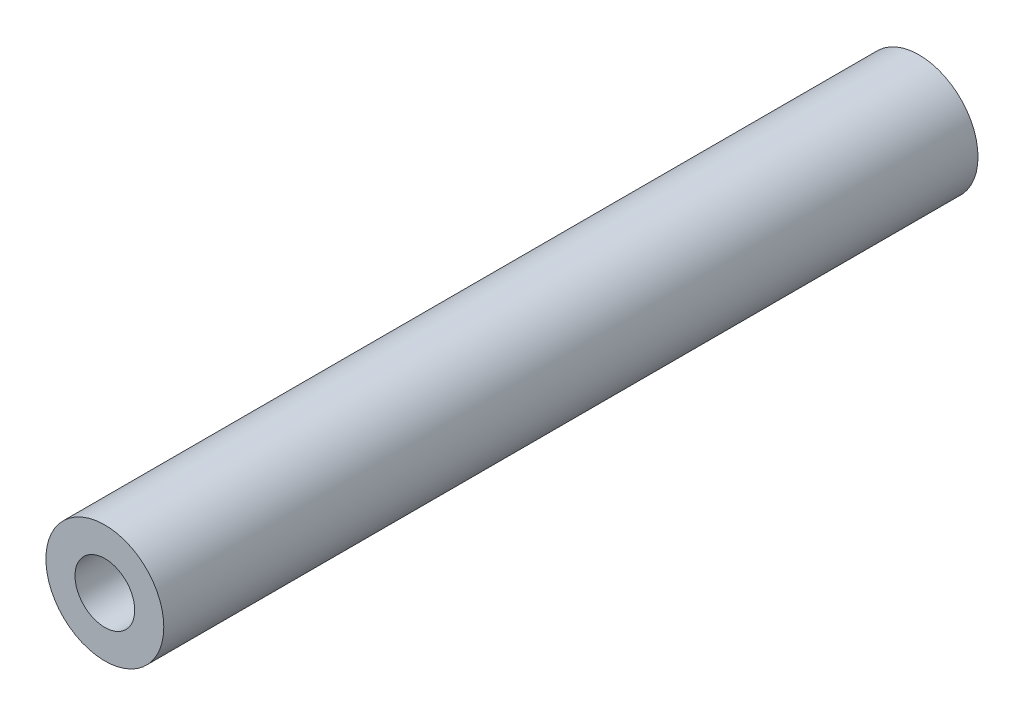
ISO-10303-21;
HEADER;
FILE_DESCRIPTION(('STEP AP214'),'2;1');
FILE_NAME('part.step','',(''),(''),'','','');
FILE_SCHEMA(('AUTOMOTIVE_DESIGN { 1 0 10303 214 1 1 1 1 }'));
ENDSEC;
DATA;
#1=APPLICATION_CONTEXT('core data for automotive mechanical design processes');
#2=APPLICATION_PROTOCOL_DEFINITION('international standard','automotive_design',2000,#1);
#3=PRODUCT_CONTEXT('',#1,'mechanical');
#4=PRODUCT('Part','Part','',(#3));
#5=PRODUCT_RELATED_PRODUCT_CATEGORY('part','',(#4));
#6=PRODUCT_DEFINITION_FORMATION('','',#4);
#7=PRODUCT_DEFINITION_CONTEXT('part definition',#1,'design');
#8=PRODUCT_DEFINITION('design','',#6,#7);
#9=PRODUCT_DEFINITION_SHAPE('','',#8);
#10=(LENGTH_UNIT() NAMED_UNIT(*) SI_UNIT(.MILLI.,.METRE.));
#11=(NAMED_UNIT(*) PLANE_ANGLE_UNIT() SI_UNIT($,.RADIAN.));
#12=(NAMED_UNIT(*) SI_UNIT($,.STERADIAN.) SOLID_ANGLE_UNIT());
#13=UNCERTAINTY_MEASURE_WITH_UNIT(LENGTH_MEASURE(1.E-05),#10,'distance_accuracy_value','');
#14=(GEOMETRIC_REPRESENTATION_CONTEXT(3) GLOBAL_UNCERTAINTY_ASSIGNED_CONTEXT((#13)) GLOBAL_UNIT_ASSIGNED_CONTEXT((#10,
#11,#12)) REPRESENTATION_CONTEXT('',''));
#15=CARTESIAN_POINT('',(0.,0.,0.));
#16=DIRECTION('',(0.,0.,1.));
#17=DIRECTION('',(1.,0.,0.));
#18=AXIS2_PLACEMENT_3D('',#15,#16,#17);
#19=CARTESIAN_POINT('',(0.,0.,13.50645));
#20=DIRECTION('',(0.,0.,1.));
#21=DIRECTION('',(1.,0.,0.));
#22=AXIS2_PLACEMENT_3D('',#19,#20,#21);
#23=PLANE('',#22);
#24=CARTESIAN_POINT('',(0.,0.,13.50645));
#25=DIRECTION('',(0.,0.,1.));
#26=DIRECTION('',(1.,0.,0.));
#27=AXIS2_PLACEMENT_3D('',#24,#25,#26);
#28=CIRCLE('',#27,1.9558);
#29=CARTESIAN_POINT('',(1.9558,0.,13.50645));
#30=VERTEX_POINT('',#29);
#31=EDGE_CURVE('E10',#30,#30,#28,.T.);
#32=ORIENTED_EDGE('',*,*,#31,.T.);
#33=EDGE_LOOP('',(#32));
#34=FACE_BOUND('',#33,.T.);
#35=CARTESIAN_POINT('',(0.,0.,13.50645));
#36=DIRECTION('',(0.,0.,1.));
#37=DIRECTION('',(1.,0.,0.));
#38=AXIS2_PLACEMENT_3D('',#35,#36,#37);
#39=CIRCLE('',#38,0.9906);
#40=CARTESIAN_POINT('',(0.9906,0.,13.50645));
#41=VERTEX_POINT('',#40);
#42=EDGE_CURVE('E42',#41,#41,#39,.T.);
#43=ORIENTED_EDGE('',*,*,#42,.F.);
#44=EDGE_LOOP('',(#43));
#45=FACE_BOUND('',#44,.T.);
#46=ADVANCED_FACE('F31',(#34,#45),#23,.T.);
#47=CARTESIAN_POINT('',(0.,0.,-13.50645));
#48=DIRECTION('',(0.,0.,1.));
#49=DIRECTION('',(1.,0.,0.));
#50=AXIS2_PLACEMENT_3D('',#47,#48,#49);
#51=PLANE('',#50);
#52=CARTESIAN_POINT('',(0.,0.,-13.50645));
#53=DIRECTION('',(0.,0.,1.));
#54=DIRECTION('',(1.,0.,0.));
#55=AXIS2_PLACEMENT_3D('',#52,#53,#54);
#56=CIRCLE('',#55,1.9558);
#57=CARTESIAN_POINT('',(1.9558,0.,-13.50645));
#58=VERTEX_POINT('',#57);
#59=EDGE_CURVE('E35',#58,#58,#56,.T.);
#60=ORIENTED_EDGE('',*,*,#59,.F.);
#61=EDGE_LOOP('',(#60));
#62=FACE_BOUND('',#61,.T.);
#63=CARTESIAN_POINT('',(0.,0.,-13.50645));
#64=DIRECTION('',(0.,0.,1.));
#65=DIRECTION('',(1.,0.,0.));
#66=AXIS2_PLACEMENT_3D('',#63,#64,#65);
#67=CIRCLE('',#66,0.9906);
#68=CARTESIAN_POINT('',(0.9906,0.,-13.50645));
#69=VERTEX_POINT('',#68);
#70=EDGE_CURVE('E44',#69,#69,#67,.T.);
#71=ORIENTED_EDGE('',*,*,#70,.T.);
#72=EDGE_LOOP('',(#71));
#73=FACE_BOUND('',#72,.T.);
#74=ADVANCED_FACE('F54',(#62,#73),#51,.F.);
#75=CARTESIAN_POINT('',(0.,0.,13.50645));
#76=DIRECTION('',(0.,0.,-1.));
#77=DIRECTION('',(-1.,0.,0.));
#78=AXIS2_PLACEMENT_3D('',#75,#76,#77);
#79=CYLINDRICAL_SURFACE('',#78,1.9558);
#80=ORIENTED_EDGE('',*,*,#31,.F.);
#81=EDGE_LOOP('',(#80));
#82=FACE_BOUND('',#81,.T.);
#83=ORIENTED_EDGE('',*,*,#59,.T.);
#84=EDGE_LOOP('',(#83));
#85=FACE_BOUND('',#84,.T.);
#86=ADVANCED_FACE('F33',(#82,#85),#79,.T.);
#87=CARTESIAN_POINT('',(0.,0.,13.50645));
#88=DIRECTION('',(0.,0.,-1.));
#89=DIRECTION('',(-1.,0.,0.));
#90=AXIS2_PLACEMENT_3D('',#87,#88,#89);
#91=CYLINDRICAL_SURFACE('',#90,0.9906);
#92=ORIENTED_EDGE('',*,*,#42,.T.);
#93=EDGE_LOOP('',(#92));
#94=FACE_BOUND('',#93,.T.);
#95=ORIENTED_EDGE('',*,*,#70,.F.);
#96=EDGE_LOOP('',(#95));
#97=FACE_BOUND('',#96,.T.);
#98=ADVANCED_FACE('F50',(#94,#97),#91,.F.);
#99=CLOSED_SHELL('',(#46,#74,#86,#98));
#100=MANIFOLD_SOLID_BREP('B2',#99);
#101=ADVANCED_BREP_SHAPE_REPRESENTATION('',(#18,#100),#14);
#102=SHAPE_DEFINITION_REPRESENTATION(#9,#101);
ENDSEC;
END-ISO-10303-21;
